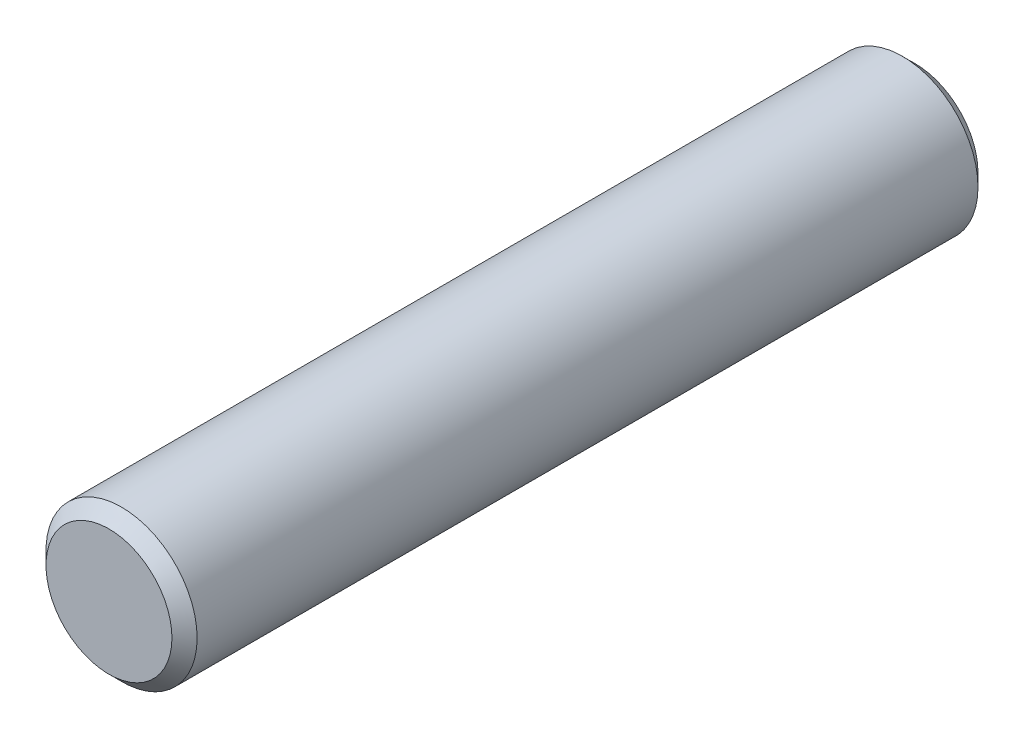
ISO-10303-21;
HEADER;
FILE_DESCRIPTION(('STEP AP214'),'2;1');
FILE_NAME('part.step','',(''),(''),'','','');
FILE_SCHEMA(('AUTOMOTIVE_DESIGN { 1 0 10303 214 1 1 1 1 }'));
ENDSEC;
DATA;
#1=APPLICATION_CONTEXT('core data for automotive mechanical design processes');
#2=APPLICATION_PROTOCOL_DEFINITION('international standard','automotive_design',2000,#1);
#3=PRODUCT_CONTEXT('',#1,'mechanical');
#4=PRODUCT('Part','Part','',(#3));
#5=PRODUCT_RELATED_PRODUCT_CATEGORY('part','',(#4));
#6=PRODUCT_DEFINITION_FORMATION('','',#4);
#7=PRODUCT_DEFINITION_CONTEXT('part definition',#1,'design');
#8=PRODUCT_DEFINITION('design','',#6,#7);
#9=PRODUCT_DEFINITION_SHAPE('','',#8);
#10=(LENGTH_UNIT() NAMED_UNIT(*) SI_UNIT(.MILLI.,.METRE.));
#11=(NAMED_UNIT(*) PLANE_ANGLE_UNIT() SI_UNIT($,.RADIAN.));
#12=(NAMED_UNIT(*) SI_UNIT($,.STERADIAN.) SOLID_ANGLE_UNIT());
#13=UNCERTAINTY_MEASURE_WITH_UNIT(LENGTH_MEASURE(1.E-05),#10,'distance_accuracy_value','');
#14=(GEOMETRIC_REPRESENTATION_CONTEXT(3) GLOBAL_UNCERTAINTY_ASSIGNED_CONTEXT((#13)) GLOBAL_UNIT_ASSIGNED_CONTEXT((#10,
#11,#12)) REPRESENTATION_CONTEXT('',''));
#15=CARTESIAN_POINT('',(0.,0.,0.));
#16=DIRECTION('',(0.,0.,1.));
#17=DIRECTION('',(1.,0.,0.));
#18=AXIS2_PLACEMENT_3D('',#15,#16,#17);
#19=CARTESIAN_POINT('',(0.,0.,16.));
#20=DIRECTION('',(0.,0.,-1.));
#21=DIRECTION('',(-1.,0.,0.));
#22=AXIS2_PLACEMENT_3D('',#19,#20,#21);
#23=CYLINDRICAL_SURFACE('',#22,3.);
#24=CARTESIAN_POINT('',(0.,0.,-15.5));
#25=DIRECTION('',(0.,0.,1.));
#26=DIRECTION('',(1.,0.,0.));
#27=AXIS2_PLACEMENT_3D('',#24,#25,#26);
#28=CIRCLE('',#27,3.);
#29=CARTESIAN_POINT('',(3.,0.,-15.5));
#30=VERTEX_POINT('',#29);
#31=EDGE_CURVE('E59',#30,#30,#28,.T.);
#32=ORIENTED_EDGE('',*,*,#31,.T.);
#33=EDGE_LOOP('',(#32));
#34=FACE_BOUND('',#33,.T.);
#35=CARTESIAN_POINT('',(0.,0.,15.5));
#36=DIRECTION('',(0.,0.,1.));
#37=DIRECTION('',(1.,0.,0.));
#38=AXIS2_PLACEMENT_3D('',#35,#36,#37);
#39=CIRCLE('',#38,3.);
#40=CARTESIAN_POINT('',(3.,0.,15.5));
#41=VERTEX_POINT('',#40);
#42=EDGE_CURVE('E64',#41,#41,#39,.F.);
#43=ORIENTED_EDGE('',*,*,#42,.T.);
#44=EDGE_LOOP('',(#43));
#45=FACE_BOUND('',#44,.T.);
#46=ADVANCED_FACE('F45',(#34,#45),#23,.T.);
#47=CARTESIAN_POINT('',(0.,0.,16.));
#48=DIRECTION('',(0.,0.,1.));
#49=DIRECTION('',(1.,0.,0.));
#50=AXIS2_PLACEMENT_3D('',#47,#48,#49);
#51=PLANE('',#50);
#52=CARTESIAN_POINT('',(0.,0.,16.));
#53=DIRECTION('',(0.,0.,1.));
#54=DIRECTION('',(1.,0.,0.));
#55=AXIS2_PLACEMENT_3D('',#52,#53,#54);
#56=CIRCLE('',#55,2.50000000000001);
#57=CARTESIAN_POINT('',(2.50000000000001,0.,16.));
#58=VERTEX_POINT('',#57);
#59=EDGE_CURVE('E10',#58,#58,#56,.T.);
#60=ORIENTED_EDGE('',*,*,#59,.T.);
#61=EDGE_LOOP('',(#60));
#62=FACE_BOUND('',#61,.T.);
#63=ADVANCED_FACE('F81',(#62),#51,.T.);
#64=CARTESIAN_POINT('',(0.,0.,-16.));
#65=DIRECTION('',(0.,0.,1.));
#66=DIRECTION('',(1.,0.,0.));
#67=AXIS2_PLACEMENT_3D('',#64,#65,#66);
#68=PLANE('',#67);
#69=CARTESIAN_POINT('',(0.,0.,-16.));
#70=DIRECTION('',(0.,0.,1.));
#71=DIRECTION('',(1.,0.,0.));
#72=AXIS2_PLACEMENT_3D('',#69,#70,#71);
#73=CIRCLE('',#72,2.49999999999999);
#74=CARTESIAN_POINT('',(2.49999999999999,0.,-16.));
#75=VERTEX_POINT('',#74);
#76=EDGE_CURVE('E54',#75,#75,#73,.F.);
#77=ORIENTED_EDGE('',*,*,#76,.T.);
#78=EDGE_LOOP('',(#77));
#79=FACE_BOUND('',#78,.T.);
#80=ADVANCED_FACE('F78',(#79),#68,.F.);
#81=CARTESIAN_POINT('',(0.,0.,-15.5));
#82=DIRECTION('',(0.,0.,1.));
#83=DIRECTION('',(1.,0.,0.));
#84=AXIS2_PLACEMENT_3D('',#81,#82,#83);
#85=CONICAL_SURFACE('',#84,3.,0.785398163397456);
#86=ORIENTED_EDGE('',*,*,#76,.F.);
#87=EDGE_LOOP('',(#86));
#88=FACE_BOUND('',#87,.T.);
#89=ORIENTED_EDGE('',*,*,#31,.F.);
#90=EDGE_LOOP('',(#89));
#91=FACE_BOUND('',#90,.T.);
#92=ADVANCED_FACE('F74',(#88,#91),#85,.T.);
#93=CARTESIAN_POINT('',(0.,0.,16.));
#94=DIRECTION('',(0.,0.,-1.));
#95=DIRECTION('',(-1.,0.,0.));
#96=AXIS2_PLACEMENT_3D('',#93,#94,#95);
#97=CONICAL_SURFACE('',#96,2.50000000000001,0.785398163397448);
#98=ORIENTED_EDGE('',*,*,#42,.F.);
#99=EDGE_LOOP('',(#98));
#100=FACE_BOUND('',#99,.T.);
#101=ORIENTED_EDGE('',*,*,#59,.F.);
#102=EDGE_LOOP('',(#101));
#103=FACE_BOUND('',#102,.T.);
#104=ADVANCED_FACE('F48',(#100,#103),#97,.T.);
#105=CLOSED_SHELL('',(#46,#63,#80,#92,#104));
#106=MANIFOLD_SOLID_BREP('B2',#105);
#107=ADVANCED_BREP_SHAPE_REPRESENTATION('',(#18,#106),#14);
#108=SHAPE_DEFINITION_REPRESENTATION(#9,#107);
ENDSEC;
END-ISO-10303-21;
